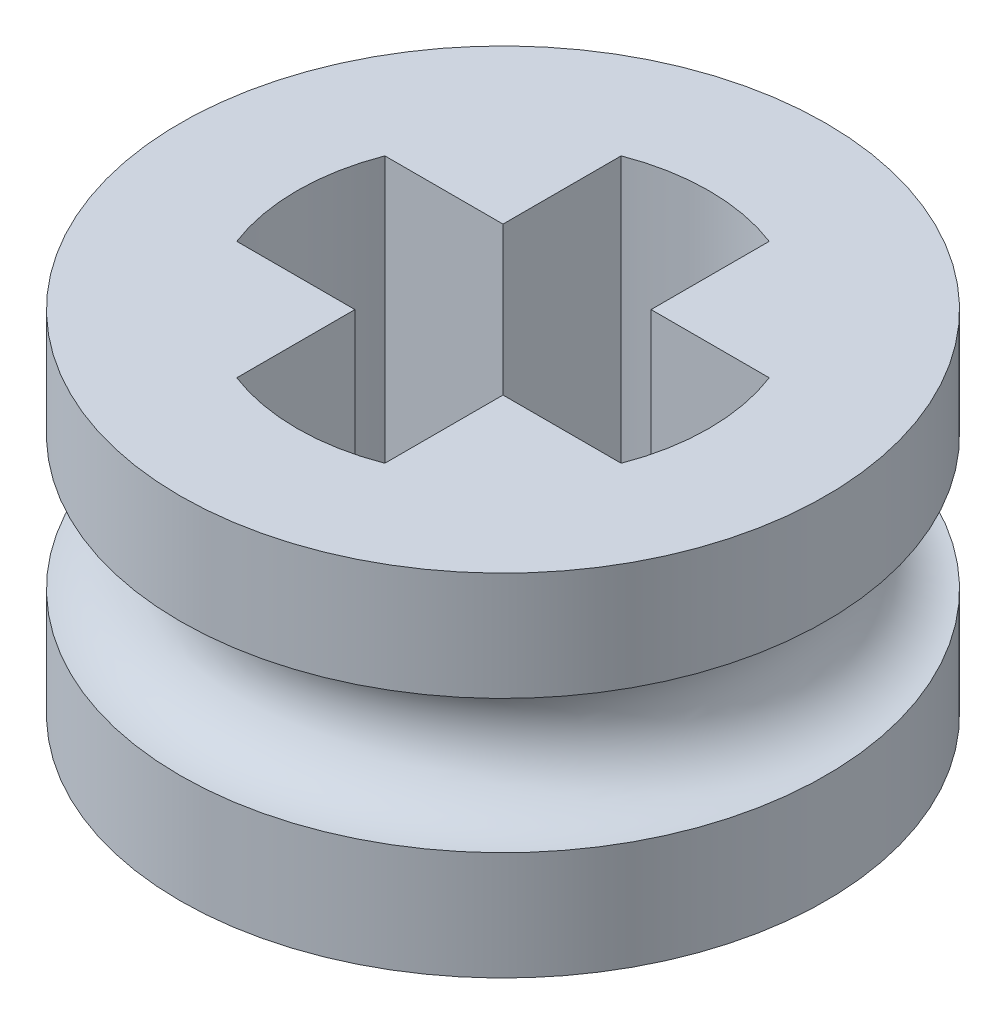
ISO-10303-21;
HEADER;
FILE_DESCRIPTION(('STEP AP214'),'2;1');
FILE_NAME('part.step','',(''),(''),'','','');
FILE_SCHEMA(('AUTOMOTIVE_DESIGN { 1 0 10303 214 1 1 1 1 }'));
ENDSEC;
DATA;
#1=APPLICATION_CONTEXT('core data for automotive mechanical design processes');
#2=APPLICATION_PROTOCOL_DEFINITION('international standard','automotive_design',2000,#1);
#3=PRODUCT_CONTEXT('',#1,'mechanical');
#4=PRODUCT('Part','Part','',(#3));
#5=PRODUCT_RELATED_PRODUCT_CATEGORY('part','',(#4));
#6=PRODUCT_DEFINITION_FORMATION('','',#4);
#7=PRODUCT_DEFINITION_CONTEXT('part definition',#1,'design');
#8=PRODUCT_DEFINITION('design','',#6,#7);
#9=PRODUCT_DEFINITION_SHAPE('','',#8);
#10=(LENGTH_UNIT() NAMED_UNIT(*) SI_UNIT(.MILLI.,.METRE.));
#11=(NAMED_UNIT(*) PLANE_ANGLE_UNIT() SI_UNIT($,.RADIAN.));
#12=(NAMED_UNIT(*) SI_UNIT($,.STERADIAN.) SOLID_ANGLE_UNIT());
#13=UNCERTAINTY_MEASURE_WITH_UNIT(LENGTH_MEASURE(1.E-05),#10,'distance_accuracy_value','');
#14=(GEOMETRIC_REPRESENTATION_CONTEXT(3) GLOBAL_UNCERTAINTY_ASSIGNED_CONTEXT((#13)) GLOBAL_UNIT_ASSIGNED_CONTEXT((#10,
#11,#12)) REPRESENTATION_CONTEXT('',''));
#15=CARTESIAN_POINT('',(0.,0.,0.));
#16=DIRECTION('',(0.,0.,1.));
#17=DIRECTION('',(1.,0.,0.));
#18=AXIS2_PLACEMENT_3D('',#15,#16,#17);
#19=CARTESIAN_POINT('',(0.844550000000046,0.,-0.844550000000013));
#20=DIRECTION('',(0.,0.,1.));
#21=DIRECTION('',(1.,0.,0.));
#22=AXIS2_PLACEMENT_3D('',#19,#20,#21);
#23=PLANE('',#22);
#24=DIRECTION('',(1.,0.,0.));
#25=VECTOR('',#24,1.);
#26=CARTESIAN_POINT('',(0.844550000000046,4.,-0.844550000000013));
#27=LINE('',#26,#25);
#28=CARTESIAN_POINT('',(2.19246107092014,4.,-0.844549999999969));
#29=VERTEX_POINT('',#28);
#30=CARTESIAN_POINT('',(0.844550000000036,4.,-0.844550000000013));
#31=VERTEX_POINT('',#30);
#32=EDGE_CURVE('E82',#29,#31,#27,.F.);
#33=ORIENTED_EDGE('',*,*,#32,.T.);
#34=DIRECTION('',(0.,1.,0.));
#35=VECTOR('',#34,1.);
#36=CARTESIAN_POINT('',(0.844550000000031,0.,-0.844550000000013));
#37=LINE('',#36,#35);
#38=CARTESIAN_POINT('',(0.844550000000036,0.,-0.844550000000013));
#39=VERTEX_POINT('',#38);
#40=EDGE_CURVE('E136',#39,#31,#37,.T.);
#41=ORIENTED_EDGE('',*,*,#40,.F.);
#42=DIRECTION('',(1.,0.,0.));
#43=VECTOR('',#42,1.);
#44=CARTESIAN_POINT('',(0.844550000000046,0.,-0.844550000000013));
#45=LINE('',#44,#43);
#46=CARTESIAN_POINT('',(2.19246107092014,0.,-0.844549999999969));
#47=VERTEX_POINT('',#46);
#48=EDGE_CURVE('E254',#39,#47,#45,.T.);
#49=ORIENTED_EDGE('',*,*,#48,.T.);
#50=DIRECTION('',(0.,1.,0.));
#51=VECTOR('',#50,1.);
#52=CARTESIAN_POINT('',(2.19246107092014,0.,-0.84454999999997));
#53=LINE('',#52,#51);
#54=EDGE_CURVE('E207',#47,#29,#53,.T.);
#55=ORIENTED_EDGE('',*,*,#54,.T.);
#56=EDGE_LOOP('',(#33,#41,#49,#55));
#57=FACE_BOUND('',#56,.T.);
#58=ADVANCED_FACE('F17',(#57),#23,.T.);
#59=CARTESIAN_POINT('',(2.19246107092011,0.,0.844550000000033));
#60=DIRECTION('',(0.,0.,-1.));
#61=DIRECTION('',(-1.,0.,0.));
#62=AXIS2_PLACEMENT_3D('',#59,#60,#61);
#63=PLANE('',#62);
#64=DIRECTION('',(-1.,0.,0.));
#65=VECTOR('',#64,1.);
#66=CARTESIAN_POINT('',(2.19246107092011,4.,0.844550000000033));
#67=LINE('',#66,#65);
#68=CARTESIAN_POINT('',(0.844550000000013,4.,0.844550000000033));
#69=VERTEX_POINT('',#68);
#70=CARTESIAN_POINT('',(2.19246107092011,4.,0.844550000000033));
#71=VERTEX_POINT('',#70);
#72=EDGE_CURVE('E241',#69,#71,#67,.F.);
#73=ORIENTED_EDGE('',*,*,#72,.T.);
#74=DIRECTION('',(0.,1.,0.));
#75=VECTOR('',#74,1.);
#76=CARTESIAN_POINT('',(2.19246107092011,0.,0.844550000000033));
#77=LINE('',#76,#75);
#78=CARTESIAN_POINT('',(2.19246107092011,0.,0.844550000000033));
#79=VERTEX_POINT('',#78);
#80=EDGE_CURVE('E204',#71,#79,#77,.F.);
#81=ORIENTED_EDGE('',*,*,#80,.T.);
#82=DIRECTION('',(-1.,0.,0.));
#83=VECTOR('',#82,1.);
#84=CARTESIAN_POINT('',(2.19246107092011,0.,0.844550000000033));
#85=LINE('',#84,#83);
#86=CARTESIAN_POINT('',(0.844550000000013,0.,0.844550000000033));
#87=VERTEX_POINT('',#86);
#88=EDGE_CURVE('E248',#79,#87,#85,.T.);
#89=ORIENTED_EDGE('',*,*,#88,.T.);
#90=DIRECTION('',(0.,1.,0.));
#91=VECTOR('',#90,1.);
#92=CARTESIAN_POINT('',(0.844550000000013,0.,0.844550000000033));
#93=LINE('',#92,#91);
#94=EDGE_CURVE('E150',#69,#87,#93,.F.);
#95=ORIENTED_EDGE('',*,*,#94,.F.);
#96=EDGE_LOOP('',(#73,#81,#89,#95));
#97=FACE_BOUND('',#96,.T.);
#98=ADVANCED_FACE('F289',(#97),#63,.T.);
#99=CARTESIAN_POINT('',(0.844550000000013,0.,0.844550000000046));
#100=DIRECTION('',(-1.,0.,0.));
#101=DIRECTION('',(0.,0.,1.));
#102=AXIS2_PLACEMENT_3D('',#99,#100,#101);
#103=PLANE('',#102);
#104=DIRECTION('',(0.,0.,1.));
#105=VECTOR('',#104,1.);
#106=CARTESIAN_POINT('',(0.844550000000013,4.,0.844550000000046));
#107=LINE('',#106,#105);
#108=CARTESIAN_POINT('',(0.844549999999971,4.,2.19246107092013));
#109=VERTEX_POINT('',#108);
#110=EDGE_CURVE('E154',#109,#69,#107,.F.);
#111=ORIENTED_EDGE('',*,*,#110,.T.);
#112=ORIENTED_EDGE('',*,*,#94,.T.);
#113=DIRECTION('',(0.,0.,1.));
#114=VECTOR('',#113,1.);
#115=CARTESIAN_POINT('',(0.844550000000013,0.,0.844550000000046));
#116=LINE('',#115,#114);
#117=CARTESIAN_POINT('',(0.844549999999971,0.,2.19246107092013));
#118=VERTEX_POINT('',#117);
#119=EDGE_CURVE('E239',#87,#118,#116,.T.);
#120=ORIENTED_EDGE('',*,*,#119,.T.);
#121=DIRECTION('',(0.,1.,0.));
#122=VECTOR('',#121,1.);
#123=CARTESIAN_POINT('',(0.844549999999972,0.,2.19246107092013));
#124=LINE('',#123,#122);
#125=EDGE_CURVE('E201',#118,#109,#124,.T.);
#126=ORIENTED_EDGE('',*,*,#125,.T.);
#127=EDGE_LOOP('',(#111,#112,#120,#126));
#128=FACE_BOUND('',#127,.T.);
#129=ADVANCED_FACE('F284',(#128),#103,.T.);
#130=CARTESIAN_POINT('',(-0.844550000000033,0.,2.19246107092011));
#131=DIRECTION('',(1.,0.,0.));
#132=DIRECTION('',(0.,0.,-1.));
#133=AXIS2_PLACEMENT_3D('',#130,#131,#132);
#134=PLANE('',#133);
#135=DIRECTION('',(0.,0.,-1.));
#136=VECTOR('',#135,1.);
#137=CARTESIAN_POINT('',(-0.844550000000033,4.,2.19246107092011));
#138=LINE('',#137,#136);
#139=CARTESIAN_POINT('',(-0.844550000000033,4.,0.844550000000014));
#140=VERTEX_POINT('',#139);
#141=CARTESIAN_POINT('',(-0.844550000000034,4.,2.19246107092011));
#142=VERTEX_POINT('',#141);
#143=EDGE_CURVE('E227',#140,#142,#138,.F.);
#144=ORIENTED_EDGE('',*,*,#143,.T.);
#145=DIRECTION('',(0.,1.,0.));
#146=VECTOR('',#145,1.);
#147=CARTESIAN_POINT('',(-0.844550000000034,0.,2.19246107092011));
#148=LINE('',#147,#146);
#149=CARTESIAN_POINT('',(-0.844550000000034,0.,2.19246107092011));
#150=VERTEX_POINT('',#149);
#151=EDGE_CURVE('E198',#142,#150,#148,.F.);
#152=ORIENTED_EDGE('',*,*,#151,.T.);
#153=DIRECTION('',(0.,0.,-1.));
#154=VECTOR('',#153,1.);
#155=CARTESIAN_POINT('',(-0.844550000000033,0.,2.19246107092011));
#156=LINE('',#155,#154);
#157=CARTESIAN_POINT('',(-0.844550000000033,0.,0.844550000000014));
#158=VERTEX_POINT('',#157);
#159=EDGE_CURVE('E153',#150,#158,#156,.T.);
#160=ORIENTED_EDGE('',*,*,#159,.T.);
#161=DIRECTION('',(0.,1.,0.));
#162=VECTOR('',#161,1.);
#163=CARTESIAN_POINT('',(-0.844550000000033,0.,0.844550000000015));
#164=LINE('',#163,#162);
#165=EDGE_CURVE('E144',#140,#158,#164,.F.);
#166=ORIENTED_EDGE('',*,*,#165,.F.);
#167=EDGE_LOOP('',(#144,#152,#160,#166));
#168=FACE_BOUND('',#167,.T.);
#169=ADVANCED_FACE('F278',(#168),#134,.T.);
#170=CARTESIAN_POINT('',(-0.844550000000046,0.,0.844550000000015));
#171=DIRECTION('',(0.,0.,-1.));
#172=DIRECTION('',(-1.,0.,0.));
#173=AXIS2_PLACEMENT_3D('',#170,#171,#172);
#174=PLANE('',#173);
#175=DIRECTION('',(-1.,0.,0.));
#176=VECTOR('',#175,1.);
#177=CARTESIAN_POINT('',(-0.844550000000046,4.,0.844550000000015));
#178=LINE('',#177,#176);
#179=CARTESIAN_POINT('',(-2.19246107092013,4.,0.844549999999972));
#180=VERTEX_POINT('',#179);
#181=EDGE_CURVE('E147',#180,#140,#178,.F.);
#182=ORIENTED_EDGE('',*,*,#181,.T.);
#183=ORIENTED_EDGE('',*,*,#165,.T.);
#184=DIRECTION('',(-1.,0.,0.));
#185=VECTOR('',#184,1.);
#186=CARTESIAN_POINT('',(-0.844550000000046,0.,0.844550000000015));
#187=LINE('',#186,#185);
#188=CARTESIAN_POINT('',(-2.19246107092013,0.,0.844549999999972));
#189=VERTEX_POINT('',#188);
#190=EDGE_CURVE('E225',#158,#189,#187,.T.);
#191=ORIENTED_EDGE('',*,*,#190,.T.);
#192=DIRECTION('',(0.,1.,0.));
#193=VECTOR('',#192,1.);
#194=CARTESIAN_POINT('',(-2.19246107092013,0.,0.844549999999971));
#195=LINE('',#194,#193);
#196=EDGE_CURVE('E195',#189,#180,#195,.T.);
#197=ORIENTED_EDGE('',*,*,#196,.T.);
#198=EDGE_LOOP('',(#182,#183,#191,#197));
#199=FACE_BOUND('',#198,.T.);
#200=ADVANCED_FACE('F271',(#199),#174,.T.);
#201=CARTESIAN_POINT('',(-2.19246107092011,0.,-0.84455000000003));
#202=DIRECTION('',(0.,0.,1.));
#203=DIRECTION('',(1.,0.,0.));
#204=AXIS2_PLACEMENT_3D('',#201,#202,#203);
#205=PLANE('',#204);
#206=DIRECTION('',(1.,0.,0.));
#207=VECTOR('',#206,1.);
#208=CARTESIAN_POINT('',(-2.19246107092011,4.,-0.84455000000003));
#209=LINE('',#208,#207);
#210=CARTESIAN_POINT('',(-0.844550000000015,4.,-0.844550000000031));
#211=VERTEX_POINT('',#210);
#212=CARTESIAN_POINT('',(-2.19246107092011,4.,-0.84455000000003));
#213=VERTEX_POINT('',#212);
#214=EDGE_CURVE('E124',#211,#213,#209,.F.);
#215=ORIENTED_EDGE('',*,*,#214,.T.);
#216=DIRECTION('',(0.,1.,0.));
#217=VECTOR('',#216,1.);
#218=CARTESIAN_POINT('',(-2.19246107092011,0.,-0.84455000000003));
#219=LINE('',#218,#217);
#220=CARTESIAN_POINT('',(-2.19246107092011,0.,-0.84455000000003));
#221=VERTEX_POINT('',#220);
#222=EDGE_CURVE('E188',#213,#221,#219,.F.);
#223=ORIENTED_EDGE('',*,*,#222,.T.);
#224=DIRECTION('',(1.,0.,0.));
#225=VECTOR('',#224,1.);
#226=CARTESIAN_POINT('',(-2.19246107092011,0.,-0.84455000000003));
#227=LINE('',#226,#225);
#228=CARTESIAN_POINT('',(-0.844550000000015,0.,-0.844550000000031));
#229=VERTEX_POINT('',#228);
#230=EDGE_CURVE('E132',#221,#229,#227,.T.);
#231=ORIENTED_EDGE('',*,*,#230,.T.);
#232=DIRECTION('',(0.,1.,0.));
#233=VECTOR('',#232,1.);
#234=CARTESIAN_POINT('',(-0.844550000000015,0.,-0.84455000000003));
#235=LINE('',#234,#233);
#236=EDGE_CURVE('E115',#211,#229,#235,.F.);
#237=ORIENTED_EDGE('',*,*,#236,.F.);
#238=EDGE_LOOP('',(#215,#223,#231,#237));
#239=FACE_BOUND('',#238,.T.);
#240=ADVANCED_FACE('F134',(#239),#205,.T.);
#241=CARTESIAN_POINT('',(-0.844550000000015,0.,-0.844550000000046));
#242=DIRECTION('',(1.,0.,0.));
#243=DIRECTION('',(0.,0.,-1.));
#244=AXIS2_PLACEMENT_3D('',#241,#242,#243);
#245=PLANE('',#244);
#246=DIRECTION('',(0.,0.,-1.));
#247=VECTOR('',#246,1.);
#248=CARTESIAN_POINT('',(-0.844550000000015,4.,-0.844550000000046));
#249=LINE('',#248,#247);
#250=CARTESIAN_POINT('',(-0.844549999999972,4.,-2.19246107092013));
#251=VERTEX_POINT('',#250);
#252=EDGE_CURVE('E111',#251,#211,#249,.F.);
#253=ORIENTED_EDGE('',*,*,#252,.T.);
#254=ORIENTED_EDGE('',*,*,#236,.T.);
#255=DIRECTION('',(0.,0.,-1.));
#256=VECTOR('',#255,1.);
#257=CARTESIAN_POINT('',(-0.844550000000015,0.,-0.844550000000046));
#258=LINE('',#257,#256);
#259=CARTESIAN_POINT('',(-0.844549999999972,0.,-2.19246107092013));
#260=VERTEX_POINT('',#259);
#261=EDGE_CURVE('E121',#229,#260,#258,.T.);
#262=ORIENTED_EDGE('',*,*,#261,.T.);
#263=DIRECTION('',(0.,1.,0.));
#264=VECTOR('',#263,1.);
#265=CARTESIAN_POINT('',(-0.844549999999971,0.,-2.19246107092013));
#266=LINE('',#265,#264);
#267=EDGE_CURVE('E118',#260,#251,#266,.T.);
#268=ORIENTED_EDGE('',*,*,#267,.T.);
#269=EDGE_LOOP('',(#253,#254,#262,#268));
#270=FACE_BOUND('',#269,.T.);
#271=ADVANCED_FACE('F113',(#270),#245,.T.);
#272=CARTESIAN_POINT('',(0.84455000000003,0.,-2.19246107092011));
#273=DIRECTION('',(-1.,0.,0.));
#274=DIRECTION('',(0.,0.,1.));
#275=AXIS2_PLACEMENT_3D('',#272,#273,#274);
#276=PLANE('',#275);
#277=DIRECTION('',(0.,0.,1.));
#278=VECTOR('',#277,1.);
#279=CARTESIAN_POINT('',(0.84455000000003,4.,-2.19246107092011));
#280=LINE('',#279,#278);
#281=CARTESIAN_POINT('',(0.84455000000003,4.,-2.19246107092011));
#282=VERTEX_POINT('',#281);
#283=EDGE_CURVE('E209',#31,#282,#280,.F.);
#284=ORIENTED_EDGE('',*,*,#283,.T.);
#285=DIRECTION('',(0.,1.,0.));
#286=VECTOR('',#285,1.);
#287=CARTESIAN_POINT('',(0.84455000000003,0.,-2.19246107092011));
#288=LINE('',#287,#286);
#289=CARTESIAN_POINT('',(0.84455000000003,0.,-2.19246107092011));
#290=VERTEX_POINT('',#289);
#291=EDGE_CURVE('E182',#282,#290,#288,.F.);
#292=ORIENTED_EDGE('',*,*,#291,.T.);
#293=DIRECTION('',(0.,0.,1.));
#294=VECTOR('',#293,1.);
#295=CARTESIAN_POINT('',(0.84455000000003,0.,-2.19246107092011));
#296=LINE('',#295,#294);
#297=EDGE_CURVE('E34',#290,#39,#296,.T.);
#298=ORIENTED_EDGE('',*,*,#297,.T.);
#299=ORIENTED_EDGE('',*,*,#40,.T.);
#300=EDGE_LOOP('',(#284,#292,#298,#299));
#301=FACE_BOUND('',#300,.T.);
#302=ADVANCED_FACE('F260',(#301),#276,.T.);
#303=CARTESIAN_POINT('',(0.,0.,0.));
#304=DIRECTION('',(0.,1.,0.));
#305=DIRECTION('',(0.,0.,1.));
#306=AXIS2_PLACEMENT_3D('',#303,#304,#305);
#307=CYLINDRICAL_SURFACE('',#306,2.34950000000005);
#308=ORIENTED_EDGE('',*,*,#80,.F.);
#309=CARTESIAN_POINT('',(0.,4.,0.));
#310=DIRECTION('',(0.,1.,0.));
#311=DIRECTION('',(0.,0.,1.));
#312=AXIS2_PLACEMENT_3D('',#309,#310,#311);
#313=CIRCLE('',#312,2.34950000000005);
#314=EDGE_CURVE('E181',#29,#71,#313,.F.);
#315=ORIENTED_EDGE('',*,*,#314,.F.);
#316=ORIENTED_EDGE('',*,*,#54,.F.);
#317=CARTESIAN_POINT('',(0.,0.,0.));
#318=DIRECTION('',(0.,1.,0.));
#319=DIRECTION('',(0.,0.,1.));
#320=AXIS2_PLACEMENT_3D('',#317,#318,#319);
#321=CIRCLE('',#320,2.34950000000005);
#322=EDGE_CURVE('E172',#47,#79,#321,.F.);
#323=ORIENTED_EDGE('',*,*,#322,.T.);
#324=EDGE_LOOP('',(#308,#315,#316,#323));
#325=FACE_BOUND('',#324,.T.);
#326=ADVANCED_FACE('F292',(#325),#307,.F.);
#327=CARTESIAN_POINT('',(0.,0.,0.));
#328=DIRECTION('',(0.,1.,0.));
#329=DIRECTION('',(0.,0.,1.));
#330=AXIS2_PLACEMENT_3D('',#327,#328,#329);
#331=CYLINDRICAL_SURFACE('',#330,2.34950000000005);
#332=ORIENTED_EDGE('',*,*,#151,.F.);
#333=CARTESIAN_POINT('',(0.,4.,0.));
#334=DIRECTION('',(0.,1.,0.));
#335=DIRECTION('',(0.,0.,1.));
#336=AXIS2_PLACEMENT_3D('',#333,#334,#335);
#337=CIRCLE('',#336,2.34950000000005);
#338=EDGE_CURVE('E178',#109,#142,#337,.F.);
#339=ORIENTED_EDGE('',*,*,#338,.F.);
#340=ORIENTED_EDGE('',*,*,#125,.F.);
#341=CARTESIAN_POINT('',(0.,0.,0.));
#342=DIRECTION('',(0.,1.,0.));
#343=DIRECTION('',(0.,0.,1.));
#344=AXIS2_PLACEMENT_3D('',#341,#342,#343);
#345=CIRCLE('',#344,2.34950000000005);
#346=EDGE_CURVE('E169',#118,#150,#345,.F.);
#347=ORIENTED_EDGE('',*,*,#346,.T.);
#348=EDGE_LOOP('',(#332,#339,#340,#347));
#349=FACE_BOUND('',#348,.T.);
#350=ADVANCED_FACE('F282',(#349),#331,.F.);
#351=CARTESIAN_POINT('',(0.,0.,0.));
#352=DIRECTION('',(0.,1.,0.));
#353=DIRECTION('',(0.,0.,1.));
#354=AXIS2_PLACEMENT_3D('',#351,#352,#353);
#355=CYLINDRICAL_SURFACE('',#354,2.34950000000005);
#356=ORIENTED_EDGE('',*,*,#222,.F.);
#357=CARTESIAN_POINT('',(0.,4.,0.));
#358=DIRECTION('',(0.,1.,0.));
#359=DIRECTION('',(0.,0.,1.));
#360=AXIS2_PLACEMENT_3D('',#357,#358,#359);
#361=CIRCLE('',#360,2.34950000000005);
#362=EDGE_CURVE('E128',#180,#213,#361,.F.);
#363=ORIENTED_EDGE('',*,*,#362,.F.);
#364=ORIENTED_EDGE('',*,*,#196,.F.);
#365=CARTESIAN_POINT('',(0.,0.,0.));
#366=DIRECTION('',(0.,1.,0.));
#367=DIRECTION('',(0.,0.,1.));
#368=AXIS2_PLACEMENT_3D('',#365,#366,#367);
#369=CIRCLE('',#368,2.34950000000005);
#370=EDGE_CURVE('E166',#189,#221,#369,.F.);
#371=ORIENTED_EDGE('',*,*,#370,.T.);
#372=EDGE_LOOP('',(#356,#363,#364,#371));
#373=FACE_BOUND('',#372,.T.);
#374=ADVANCED_FACE('F269',(#373),#355,.F.);
#375=CARTESIAN_POINT('',(0.,0.,0.));
#376=DIRECTION('',(0.,1.,0.));
#377=DIRECTION('',(0.,0.,1.));
#378=AXIS2_PLACEMENT_3D('',#375,#376,#377);
#379=CYLINDRICAL_SURFACE('',#378,2.34950000000005);
#380=ORIENTED_EDGE('',*,*,#291,.F.);
#381=CARTESIAN_POINT('',(0.,4.,0.));
#382=DIRECTION('',(0.,1.,0.));
#383=DIRECTION('',(0.,0.,1.));
#384=AXIS2_PLACEMENT_3D('',#381,#382,#383);
#385=CIRCLE('',#384,2.34950000000005);
#386=EDGE_CURVE('E175',#251,#282,#385,.F.);
#387=ORIENTED_EDGE('',*,*,#386,.F.);
#388=ORIENTED_EDGE('',*,*,#267,.F.);
#389=CARTESIAN_POINT('',(0.,0.,0.));
#390=DIRECTION('',(0.,1.,0.));
#391=DIRECTION('',(0.,0.,1.));
#392=AXIS2_PLACEMENT_3D('',#389,#390,#391);
#393=CIRCLE('',#392,2.34950000000005);
#394=EDGE_CURVE('E163',#260,#290,#393,.F.);
#395=ORIENTED_EDGE('',*,*,#394,.T.);
#396=EDGE_LOOP('',(#380,#387,#388,#395));
#397=FACE_BOUND('',#396,.T.);
#398=ADVANCED_FACE('F262',(#397),#379,.F.);
#399=CARTESIAN_POINT('',(0.,4.,0.));
#400=DIRECTION('',(0.,1.,0.));
#401=DIRECTION('',(0.,0.,1.));
#402=AXIS2_PLACEMENT_3D('',#399,#400,#401);
#403=PLANE('',#402);
#404=ORIENTED_EDGE('',*,*,#386,.T.);
#405=ORIENTED_EDGE('',*,*,#283,.F.);
#406=ORIENTED_EDGE('',*,*,#32,.F.);
#407=ORIENTED_EDGE('',*,*,#314,.T.);
#408=ORIENTED_EDGE('',*,*,#72,.F.);
#409=ORIENTED_EDGE('',*,*,#110,.F.);
#410=ORIENTED_EDGE('',*,*,#338,.T.);
#411=ORIENTED_EDGE('',*,*,#143,.F.);
#412=ORIENTED_EDGE('',*,*,#181,.F.);
#413=ORIENTED_EDGE('',*,*,#362,.T.);
#414=ORIENTED_EDGE('',*,*,#214,.F.);
#415=ORIENTED_EDGE('',*,*,#252,.F.);
#416=EDGE_LOOP('',(#404,#405,#406,#407,#408,#409,#410,#411,#412,#413,#414,#415));
#417=FACE_BOUND('',#416,.T.);
#418=CARTESIAN_POINT('',(0.,4.,0.));
#419=DIRECTION('',(0.,1.,0.));
#420=DIRECTION('',(0.,0.,1.));
#421=AXIS2_PLACEMENT_3D('',#418,#419,#420);
#422=CIRCLE('',#421,3.683);
#423=CARTESIAN_POINT('',(0.,4.,3.683));
#424=VERTEX_POINT('',#423);
#425=EDGE_CURVE('E160',#424,#424,#422,.F.);
#426=ORIENTED_EDGE('',*,*,#425,.F.);
#427=EDGE_LOOP('',(#426));
#428=FACE_BOUND('',#427,.T.);
#429=ADVANCED_FACE('F125',(#417,#428),#403,.T.);
#430=CARTESIAN_POINT('',(0.,0.,0.));
#431=DIRECTION('',(0.,1.,0.));
#432=DIRECTION('',(0.,0.,1.));
#433=AXIS2_PLACEMENT_3D('',#430,#431,#432);
#434=PLANE('',#433);
#435=ORIENTED_EDGE('',*,*,#297,.F.);
#436=ORIENTED_EDGE('',*,*,#394,.F.);
#437=ORIENTED_EDGE('',*,*,#261,.F.);
#438=ORIENTED_EDGE('',*,*,#230,.F.);
#439=ORIENTED_EDGE('',*,*,#370,.F.);
#440=ORIENTED_EDGE('',*,*,#190,.F.);
#441=ORIENTED_EDGE('',*,*,#159,.F.);
#442=ORIENTED_EDGE('',*,*,#346,.F.);
#443=ORIENTED_EDGE('',*,*,#119,.F.);
#444=ORIENTED_EDGE('',*,*,#88,.F.);
#445=ORIENTED_EDGE('',*,*,#322,.F.);
#446=ORIENTED_EDGE('',*,*,#48,.F.);
#447=EDGE_LOOP('',(#435,#436,#437,#438,#439,#440,#441,#442,#443,#444,#445,#446));
#448=FACE_BOUND('',#447,.T.);
#449=CARTESIAN_POINT('',(0.,0.,0.));
#450=DIRECTION('',(0.,1.,0.));
#451=DIRECTION('',(0.,0.,1.));
#452=AXIS2_PLACEMENT_3D('',#449,#450,#451);
#453=CIRCLE('',#452,3.683);
#454=CARTESIAN_POINT('',(0.,0.,3.683));
#455=VERTEX_POINT('',#454);
#456=EDGE_CURVE('E157',#455,#455,#453,.T.);
#457=ORIENTED_EDGE('',*,*,#456,.F.);
#458=EDGE_LOOP('',(#457));
#459=FACE_BOUND('',#458,.T.);
#460=ADVANCED_FACE('F263',(#448,#459),#434,.F.);
#461=CARTESIAN_POINT('',(0.,0.,0.));
#462=DIRECTION('',(0.,1.,0.));
#463=DIRECTION('',(0.,0.,1.));
#464=AXIS2_PLACEMENT_3D('',#461,#462,#463);
#465=CYLINDRICAL_SURFACE('',#464,3.683);
#466=CARTESIAN_POINT('',(0.,2.762,0.));
#467=DIRECTION('',(0.,-1.,0.));
#468=DIRECTION('',(0.,0.,-1.));
#469=AXIS2_PLACEMENT_3D('',#466,#467,#468);
#470=CIRCLE('',#469,3.683);
#471=CARTESIAN_POINT('',(0.,2.762,-3.683));
#472=VERTEX_POINT('',#471);
#473=EDGE_CURVE('E26',#472,#472,#470,.F.);
#474=ORIENTED_EDGE('',*,*,#473,.T.);
#475=EDGE_LOOP('',(#474));
#476=FACE_BOUND('',#475,.T.);
#477=ORIENTED_EDGE('',*,*,#425,.T.);
#478=EDGE_LOOP('',(#477));
#479=FACE_BOUND('',#478,.T.);
#480=ADVANCED_FACE('F306',(#476,#479),#465,.T.);
#481=CARTESIAN_POINT('',(0.,0.,0.));
#482=DIRECTION('',(0.,1.,0.));
#483=DIRECTION('',(0.,0.,1.));
#484=AXIS2_PLACEMENT_3D('',#481,#482,#483);
#485=CYLINDRICAL_SURFACE('',#484,3.683);
#486=ORIENTED_EDGE('',*,*,#456,.T.);
#487=EDGE_LOOP('',(#486));
#488=FACE_BOUND('',#487,.T.);
#489=CARTESIAN_POINT('',(0.,1.238,0.));
#490=DIRECTION('',(0.,-1.,0.));
#491=DIRECTION('',(0.,0.,-1.));
#492=AXIS2_PLACEMENT_3D('',#489,#490,#491);
#493=CIRCLE('',#492,3.683);
#494=CARTESIAN_POINT('',(0.,1.238,-3.683));
#495=VERTEX_POINT('',#494);
#496=EDGE_CURVE('E11',#495,#495,#493,.T.);
#497=ORIENTED_EDGE('',*,*,#496,.T.);
#498=EDGE_LOOP('',(#497));
#499=FACE_BOUND('',#498,.T.);
#500=ADVANCED_FACE('F300',(#488,#499),#485,.T.);
#501=CARTESIAN_POINT('',(0.,2.,0.));
#502=DIRECTION('',(0.,-1.,0.));
#503=DIRECTION('',(0.,0.,-1.));
#504=AXIS2_PLACEMENT_3D('',#501,#502,#503);
#505=TOROIDAL_SURFACE('',#504,3.683,0.762);
#506=ORIENTED_EDGE('',*,*,#473,.F.);
#507=EDGE_LOOP('',(#506));
#508=FACE_BOUND('',#507,.T.);
#509=ORIENTED_EDGE('',*,*,#496,.F.);
#510=EDGE_LOOP('',(#509));
#511=FACE_BOUND('',#510,.T.);
#512=ADVANCED_FACE('F298',(#508,#511),#505,.F.);
#513=CLOSED_SHELL('',(#58,#98,#129,#169,#200,#240,#271,#302,#326,#350,#374,#398,#429,#460,#480,
#500,#512));
#514=MANIFOLD_SOLID_BREP('B1',#513);
#515=ADVANCED_BREP_SHAPE_REPRESENTATION('',(#18,#514),#14);
#516=SHAPE_DEFINITION_REPRESENTATION(#9,#515);
ENDSEC;
END-ISO-10303-21;
